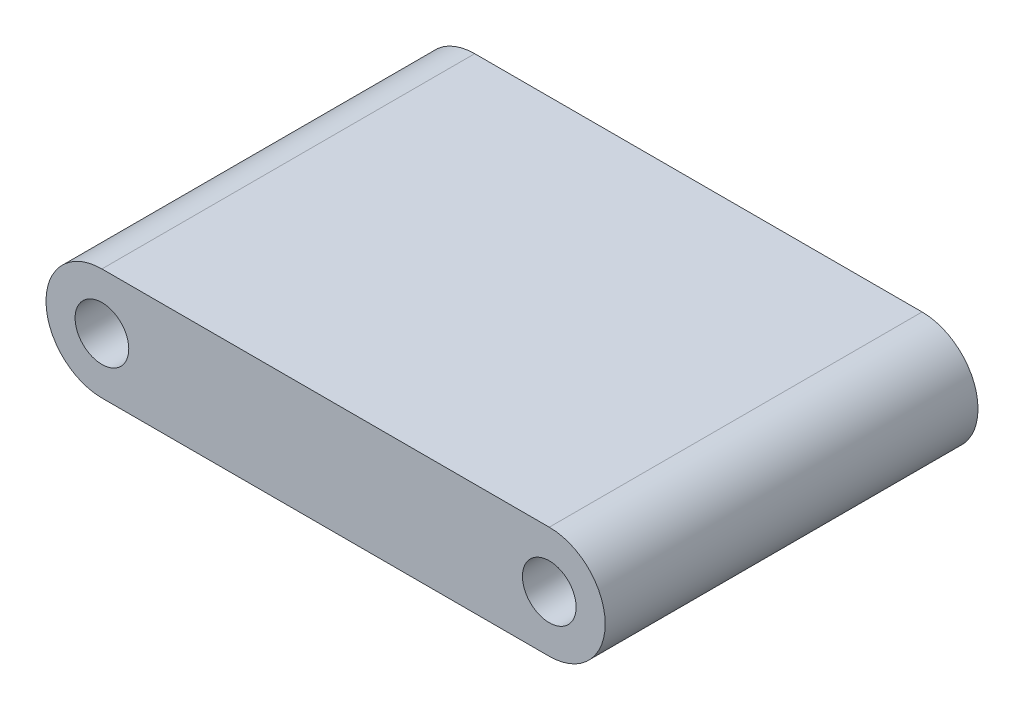
ISO-10303-21;
HEADER;
FILE_DESCRIPTION(('STEP AP214'),'2;1');
FILE_NAME('part.step','',(''),(''),'','','');
FILE_SCHEMA(('AUTOMOTIVE_DESIGN { 1 0 10303 214 1 1 1 1 }'));
ENDSEC;
DATA;
#1=APPLICATION_CONTEXT('core data for automotive mechanical design processes');
#2=APPLICATION_PROTOCOL_DEFINITION('international standard','automotive_design',2000,#1);
#3=PRODUCT_CONTEXT('',#1,'mechanical');
#4=PRODUCT('Part','Part','',(#3));
#5=PRODUCT_RELATED_PRODUCT_CATEGORY('part','',(#4));
#6=PRODUCT_DEFINITION_FORMATION('','',#4);
#7=PRODUCT_DEFINITION_CONTEXT('part definition',#1,'design');
#8=PRODUCT_DEFINITION('design','',#6,#7);
#9=PRODUCT_DEFINITION_SHAPE('','',#8);
#10=(LENGTH_UNIT() NAMED_UNIT(*) SI_UNIT(.MILLI.,.METRE.));
#11=(NAMED_UNIT(*) PLANE_ANGLE_UNIT() SI_UNIT($,.RADIAN.));
#12=(NAMED_UNIT(*) SI_UNIT($,.STERADIAN.) SOLID_ANGLE_UNIT());
#13=UNCERTAINTY_MEASURE_WITH_UNIT(LENGTH_MEASURE(1.E-05),#10,'distance_accuracy_value','');
#14=(GEOMETRIC_REPRESENTATION_CONTEXT(3) GLOBAL_UNCERTAINTY_ASSIGNED_CONTEXT((#13)) GLOBAL_UNIT_ASSIGNED_CONTEXT((#10,
#11,#12)) REPRESENTATION_CONTEXT('',''));
#15=CARTESIAN_POINT('',(0.,0.,0.));
#16=DIRECTION('',(0.,0.,1.));
#17=DIRECTION('',(1.,0.,0.));
#18=AXIS2_PLACEMENT_3D('',#15,#16,#17);
#19=CARTESIAN_POINT('',(0.,0.,31.75));
#20=DIRECTION('',(0.,0.,1.));
#21=DIRECTION('',(1.,0.,0.));
#22=AXIS2_PLACEMENT_3D('',#19,#20,#21);
#23=PLANE('',#22);
#24=CARTESIAN_POINT('',(0.,0.,31.75));
#25=DIRECTION('',(0.,0.,1.));
#26=DIRECTION('',(1.,0.,0.));
#27=AXIS2_PLACEMENT_3D('',#24,#25,#26);
#28=CIRCLE('',#27,2.286);
#29=CARTESIAN_POINT('',(2.286,0.,31.75));
#30=VERTEX_POINT('',#29);
#31=EDGE_CURVE('E118',#30,#30,#28,.T.);
#32=ORIENTED_EDGE('',*,*,#31,.F.);
#33=EDGE_LOOP('',(#32));
#34=FACE_BOUND('',#33,.T.);
#35=CARTESIAN_POINT('',(0.,0.,31.75));
#36=DIRECTION('',(0.,0.,1.));
#37=DIRECTION('',(1.,0.,0.));
#38=AXIS2_PLACEMENT_3D('',#35,#36,#37);
#39=CIRCLE('',#38,4.7625);
#40=CARTESIAN_POINT('',(0.,4.7625,31.75));
#41=VERTEX_POINT('',#40);
#42=CARTESIAN_POINT('',(0.,-4.7625,31.75));
#43=VERTEX_POINT('',#42);
#44=EDGE_CURVE('E98',#41,#43,#39,.T.);
#45=ORIENTED_EDGE('',*,*,#44,.T.);
#46=DIRECTION('',(1.,0.,0.));
#47=VECTOR('',#46,1.);
#48=CARTESIAN_POINT('',(0.,-4.7625,31.75));
#49=LINE('',#48,#47);
#50=CARTESIAN_POINT('',(38.1,-4.7625,31.75));
#51=VERTEX_POINT('',#50);
#52=EDGE_CURVE('E93',#43,#51,#49,.T.);
#53=ORIENTED_EDGE('',*,*,#52,.T.);
#54=CARTESIAN_POINT('',(38.1,0.,31.75));
#55=DIRECTION('',(0.,0.,1.));
#56=DIRECTION('',(1.,0.,0.));
#57=AXIS2_PLACEMENT_3D('',#54,#55,#56);
#58=CIRCLE('',#57,4.7625);
#59=CARTESIAN_POINT('',(38.1,4.7625,31.75));
#60=VERTEX_POINT('',#59);
#61=EDGE_CURVE('E96',#51,#60,#58,.T.);
#62=ORIENTED_EDGE('',*,*,#61,.T.);
#63=DIRECTION('',(-1.,0.,0.));
#64=VECTOR('',#63,1.);
#65=CARTESIAN_POINT('',(0.,4.7625,31.75));
#66=LINE('',#65,#64);
#67=EDGE_CURVE('E63',#60,#41,#66,.T.);
#68=ORIENTED_EDGE('',*,*,#67,.T.);
#69=EDGE_LOOP('',(#45,#53,#62,#68));
#70=FACE_BOUND('',#69,.T.);
#71=CARTESIAN_POINT('',(38.1,0.,31.75));
#72=DIRECTION('',(0.,0.,1.));
#73=DIRECTION('',(1.,0.,0.));
#74=AXIS2_PLACEMENT_3D('',#71,#72,#73);
#75=CIRCLE('',#74,2.286);
#76=CARTESIAN_POINT('',(40.386,0.,31.75));
#77=VERTEX_POINT('',#76);
#78=EDGE_CURVE('E140',#77,#77,#75,.T.);
#79=ORIENTED_EDGE('',*,*,#78,.F.);
#80=EDGE_LOOP('',(#79));
#81=FACE_BOUND('',#80,.T.);
#82=ADVANCED_FACE('F45',(#34,#70,#81),#23,.T.);
#83=CARTESIAN_POINT('',(0.,0.,0.));
#84=DIRECTION('',(0.,0.,1.));
#85=DIRECTION('',(1.,0.,0.));
#86=AXIS2_PLACEMENT_3D('',#83,#84,#85);
#87=PLANE('',#86);
#88=CARTESIAN_POINT('',(0.,0.,0.));
#89=DIRECTION('',(0.,0.,1.));
#90=DIRECTION('',(1.,0.,0.));
#91=AXIS2_PLACEMENT_3D('',#88,#89,#90);
#92=CIRCLE('',#91,4.7625);
#93=CARTESIAN_POINT('',(0.,4.7625,0.));
#94=VERTEX_POINT('',#93);
#95=CARTESIAN_POINT('',(0.,-4.7625,0.));
#96=VERTEX_POINT('',#95);
#97=EDGE_CURVE('E114',#94,#96,#92,.T.);
#98=ORIENTED_EDGE('',*,*,#97,.F.);
#99=DIRECTION('',(-1.,0.,0.));
#100=VECTOR('',#99,1.);
#101=CARTESIAN_POINT('',(0.,4.7625,0.));
#102=LINE('',#101,#100);
#103=CARTESIAN_POINT('',(38.1,4.7625,0.));
#104=VERTEX_POINT('',#103);
#105=EDGE_CURVE('E86',#104,#94,#102,.T.);
#106=ORIENTED_EDGE('',*,*,#105,.F.);
#107=CARTESIAN_POINT('',(38.1,0.,0.));
#108=DIRECTION('',(0.,0.,1.));
#109=DIRECTION('',(1.,0.,0.));
#110=AXIS2_PLACEMENT_3D('',#107,#108,#109);
#111=CIRCLE('',#110,4.7625);
#112=CARTESIAN_POINT('',(38.1,-4.7625,0.));
#113=VERTEX_POINT('',#112);
#114=EDGE_CURVE('E80',#113,#104,#111,.T.);
#115=ORIENTED_EDGE('',*,*,#114,.F.);
#116=DIRECTION('',(1.,0.,0.));
#117=VECTOR('',#116,1.);
#118=CARTESIAN_POINT('',(0.,-4.7625,0.));
#119=LINE('',#118,#117);
#120=EDGE_CURVE('E103',#96,#113,#119,.T.);
#121=ORIENTED_EDGE('',*,*,#120,.F.);
#122=EDGE_LOOP('',(#98,#106,#115,#121));
#123=FACE_BOUND('',#122,.T.);
#124=CARTESIAN_POINT('',(0.,0.,0.));
#125=DIRECTION('',(0.,0.,1.));
#126=DIRECTION('',(1.,0.,0.));
#127=AXIS2_PLACEMENT_3D('',#124,#125,#126);
#128=CIRCLE('',#127,2.286);
#129=CARTESIAN_POINT('',(2.286,0.,0.));
#130=VERTEX_POINT('',#129);
#131=EDGE_CURVE('E136',#130,#130,#128,.T.);
#132=ORIENTED_EDGE('',*,*,#131,.T.);
#133=EDGE_LOOP('',(#132));
#134=FACE_BOUND('',#133,.T.);
#135=CARTESIAN_POINT('',(38.1,0.,0.));
#136=DIRECTION('',(0.,0.,1.));
#137=DIRECTION('',(1.,0.,0.));
#138=AXIS2_PLACEMENT_3D('',#135,#136,#137);
#139=CIRCLE('',#138,2.286);
#140=CARTESIAN_POINT('',(40.386,0.,0.));
#141=VERTEX_POINT('',#140);
#142=EDGE_CURVE('E144',#141,#141,#139,.T.);
#143=ORIENTED_EDGE('',*,*,#142,.T.);
#144=EDGE_LOOP('',(#143));
#145=FACE_BOUND('',#144,.T.);
#146=ADVANCED_FACE('F131',(#123,#134,#145),#87,.F.);
#147=CARTESIAN_POINT('',(0.,0.,31.75));
#148=DIRECTION('',(0.,0.,-1.));
#149=DIRECTION('',(-1.,0.,0.));
#150=AXIS2_PLACEMENT_3D('',#147,#148,#149);
#151=CYLINDRICAL_SURFACE('',#150,4.7625);
#152=ORIENTED_EDGE('',*,*,#97,.T.);
#153=DIRECTION('',(0.,0.,-1.));
#154=VECTOR('',#153,1.);
#155=CARTESIAN_POINT('',(0.,-4.7625,31.75));
#156=LINE('',#155,#154);
#157=EDGE_CURVE('E11',#43,#96,#156,.T.);
#158=ORIENTED_EDGE('',*,*,#157,.F.);
#159=ORIENTED_EDGE('',*,*,#44,.F.);
#160=DIRECTION('',(0.,0.,-1.));
#161=VECTOR('',#160,1.);
#162=CARTESIAN_POINT('',(0.,4.7625,31.75));
#163=LINE('',#162,#161);
#164=EDGE_CURVE('E110',#41,#94,#163,.T.);
#165=ORIENTED_EDGE('',*,*,#164,.T.);
#166=EDGE_LOOP('',(#152,#158,#159,#165));
#167=FACE_BOUND('',#166,.T.);
#168=ADVANCED_FACE('F47',(#167),#151,.T.);
#169=CARTESIAN_POINT('',(0.,-4.7625,31.75));
#170=DIRECTION('',(0.,1.,0.));
#171=DIRECTION('',(0.,0.,1.));
#172=AXIS2_PLACEMENT_3D('',#169,#170,#171);
#173=PLANE('',#172);
#174=ORIENTED_EDGE('',*,*,#120,.T.);
#175=DIRECTION('',(0.,0.,-1.));
#176=VECTOR('',#175,1.);
#177=CARTESIAN_POINT('',(38.1,-4.7625,31.75));
#178=LINE('',#177,#176);
#179=EDGE_CURVE('E55',#51,#113,#178,.T.);
#180=ORIENTED_EDGE('',*,*,#179,.F.);
#181=ORIENTED_EDGE('',*,*,#52,.F.);
#182=ORIENTED_EDGE('',*,*,#157,.T.);
#183=EDGE_LOOP('',(#174,#180,#181,#182));
#184=FACE_BOUND('',#183,.T.);
#185=ADVANCED_FACE('F102',(#184),#173,.F.);
#186=CARTESIAN_POINT('',(38.1,0.,31.75));
#187=DIRECTION('',(0.,0.,-1.));
#188=DIRECTION('',(-1.,0.,0.));
#189=AXIS2_PLACEMENT_3D('',#186,#187,#188);
#190=CYLINDRICAL_SURFACE('',#189,4.7625);
#191=ORIENTED_EDGE('',*,*,#114,.T.);
#192=DIRECTION('',(0.,0.,-1.));
#193=VECTOR('',#192,1.);
#194=CARTESIAN_POINT('',(38.1,4.7625,31.75));
#195=LINE('',#194,#193);
#196=EDGE_CURVE('E105',#60,#104,#195,.T.);
#197=ORIENTED_EDGE('',*,*,#196,.F.);
#198=ORIENTED_EDGE('',*,*,#61,.F.);
#199=ORIENTED_EDGE('',*,*,#179,.T.);
#200=EDGE_LOOP('',(#191,#197,#198,#199));
#201=FACE_BOUND('',#200,.T.);
#202=ADVANCED_FACE('F106',(#201),#190,.T.);
#203=CARTESIAN_POINT('',(0.,4.7625,31.75));
#204=DIRECTION('',(0.,-1.,0.));
#205=DIRECTION('',(0.,0.,-1.));
#206=AXIS2_PLACEMENT_3D('',#203,#204,#205);
#207=PLANE('',#206);
#208=ORIENTED_EDGE('',*,*,#105,.T.);
#209=ORIENTED_EDGE('',*,*,#164,.F.);
#210=ORIENTED_EDGE('',*,*,#67,.F.);
#211=ORIENTED_EDGE('',*,*,#196,.T.);
#212=EDGE_LOOP('',(#208,#209,#210,#211));
#213=FACE_BOUND('',#212,.T.);
#214=ADVANCED_FACE('F128',(#213),#207,.F.);
#215=CARTESIAN_POINT('',(0.,0.,31.75));
#216=DIRECTION('',(0.,0.,-1.));
#217=DIRECTION('',(-1.,0.,0.));
#218=AXIS2_PLACEMENT_3D('',#215,#216,#217);
#219=CYLINDRICAL_SURFACE('',#218,2.286);
#220=ORIENTED_EDGE('',*,*,#31,.T.);
#221=EDGE_LOOP('',(#220));
#222=FACE_BOUND('',#221,.T.);
#223=ORIENTED_EDGE('',*,*,#131,.F.);
#224=EDGE_LOOP('',(#223));
#225=FACE_BOUND('',#224,.T.);
#226=ADVANCED_FACE('F163',(#222,#225),#219,.F.);
#227=CARTESIAN_POINT('',(38.1,0.,31.75));
#228=DIRECTION('',(0.,0.,-1.));
#229=DIRECTION('',(-1.,0.,0.));
#230=AXIS2_PLACEMENT_3D('',#227,#228,#229);
#231=CYLINDRICAL_SURFACE('',#230,2.286);
#232=ORIENTED_EDGE('',*,*,#78,.T.);
#233=EDGE_LOOP('',(#232));
#234=FACE_BOUND('',#233,.T.);
#235=ORIENTED_EDGE('',*,*,#142,.F.);
#236=EDGE_LOOP('',(#235));
#237=FACE_BOUND('',#236,.T.);
#238=ADVANCED_FACE('F152',(#234,#237),#231,.F.);
#239=CLOSED_SHELL('',(#82,#146,#168,#185,#202,#214,#226,#238));
#240=MANIFOLD_SOLID_BREP('B2',#239);
#241=ADVANCED_BREP_SHAPE_REPRESENTATION('',(#18,#240),#14);
#242=SHAPE_DEFINITION_REPRESENTATION(#9,#241);
ENDSEC;
END-ISO-10303-21;
